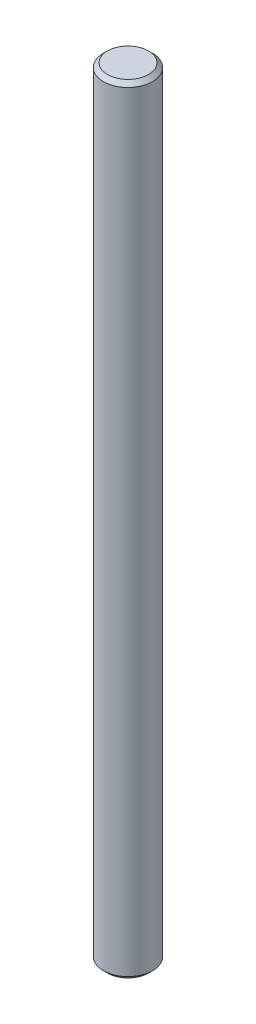
ISO-10303-21;
HEADER;
FILE_DESCRIPTION(('STEP AP214'),'2;1');
FILE_NAME('part.step','',(''),(''),'','','');
FILE_SCHEMA(('AUTOMOTIVE_DESIGN { 1 0 10303 214 1 1 1 1 }'));
ENDSEC;
DATA;
#1=APPLICATION_CONTEXT('core data for automotive mechanical design processes');
#2=APPLICATION_PROTOCOL_DEFINITION('international standard','automotive_design',2000,#1);
#3=PRODUCT_CONTEXT('',#1,'mechanical');
#4=PRODUCT('Part','Part','',(#3));
#5=PRODUCT_RELATED_PRODUCT_CATEGORY('part','',(#4));
#6=PRODUCT_DEFINITION_FORMATION('','',#4);
#7=PRODUCT_DEFINITION_CONTEXT('part definition',#1,'design');
#8=PRODUCT_DEFINITION('design','',#6,#7);
#9=PRODUCT_DEFINITION_SHAPE('','',#8);
#10=(LENGTH_UNIT() NAMED_UNIT(*) SI_UNIT(.MILLI.,.METRE.));
#11=(NAMED_UNIT(*) PLANE_ANGLE_UNIT() SI_UNIT($,.RADIAN.));
#12=(NAMED_UNIT(*) SI_UNIT($,.STERADIAN.) SOLID_ANGLE_UNIT());
#13=UNCERTAINTY_MEASURE_WITH_UNIT(LENGTH_MEASURE(1.E-05),#10,'distance_accuracy_value','');
#14=(GEOMETRIC_REPRESENTATION_CONTEXT(3) GLOBAL_UNCERTAINTY_ASSIGNED_CONTEXT((#13)) GLOBAL_UNIT_ASSIGNED_CONTEXT((#10,
#11,#12)) REPRESENTATION_CONTEXT('',''));
#15=CARTESIAN_POINT('',(0.,0.,0.));
#16=DIRECTION('',(0.,0.,1.));
#17=DIRECTION('',(1.,0.,0.));
#18=AXIS2_PLACEMENT_3D('',#15,#16,#17);
#19=CARTESIAN_POINT('',(0.,95.,0.));
#20=DIRECTION('',(0.,-1.,0.));
#21=DIRECTION('',(0.,0.,-1.));
#22=AXIS2_PLACEMENT_3D('',#19,#20,#21);
#23=CYLINDRICAL_SURFACE('',#22,3.);
#24=CARTESIAN_POINT('',(0.,0.499999999999987,0.));
#25=DIRECTION('',(0.,1.,0.));
#26=DIRECTION('',(0.,0.,1.));
#27=AXIS2_PLACEMENT_3D('',#24,#25,#26);
#28=CIRCLE('',#27,3.);
#29=CARTESIAN_POINT('',(0.,0.499999999999987,3.));
#30=VERTEX_POINT('',#29);
#31=EDGE_CURVE('E55',#30,#30,#28,.T.);
#32=ORIENTED_EDGE('',*,*,#31,.T.);
#33=EDGE_LOOP('',(#32));
#34=FACE_BOUND('',#33,.T.);
#35=CARTESIAN_POINT('',(0.,94.5,0.));
#36=DIRECTION('',(0.,1.,0.));
#37=DIRECTION('',(0.,0.,1.));
#38=AXIS2_PLACEMENT_3D('',#35,#36,#37);
#39=CIRCLE('',#38,3.);
#40=CARTESIAN_POINT('',(0.,94.5,3.));
#41=VERTEX_POINT('',#40);
#42=EDGE_CURVE('E60',#41,#41,#39,.F.);
#43=ORIENTED_EDGE('',*,*,#42,.T.);
#44=EDGE_LOOP('',(#43));
#45=FACE_BOUND('',#44,.T.);
#46=ADVANCED_FACE('F41',(#34,#45),#23,.T.);
#47=CARTESIAN_POINT('',(0.,95.,0.));
#48=DIRECTION('',(0.,1.,0.));
#49=DIRECTION('',(0.,0.,1.));
#50=AXIS2_PLACEMENT_3D('',#47,#48,#49);
#51=PLANE('',#50);
#52=CARTESIAN_POINT('',(0.,95.,0.));
#53=DIRECTION('',(0.,1.,0.));
#54=DIRECTION('',(0.,0.,1.));
#55=AXIS2_PLACEMENT_3D('',#52,#53,#54);
#56=CIRCLE('',#55,2.5);
#57=CARTESIAN_POINT('',(0.,95.,2.5));
#58=VERTEX_POINT('',#57);
#59=EDGE_CURVE('E10',#58,#58,#56,.T.);
#60=ORIENTED_EDGE('',*,*,#59,.T.);
#61=EDGE_LOOP('',(#60));
#62=FACE_BOUND('',#61,.T.);
#63=ADVANCED_FACE('F77',(#62),#51,.T.);
#64=CARTESIAN_POINT('',(0.,0.,0.));
#65=DIRECTION('',(0.,1.,0.));
#66=DIRECTION('',(0.,0.,1.));
#67=AXIS2_PLACEMENT_3D('',#64,#65,#66);
#68=PLANE('',#67);
#69=CARTESIAN_POINT('',(0.,0.,0.));
#70=DIRECTION('',(0.,1.,0.));
#71=DIRECTION('',(0.,0.,1.));
#72=AXIS2_PLACEMENT_3D('',#69,#70,#71);
#73=CIRCLE('',#72,2.5);
#74=CARTESIAN_POINT('',(0.,0.,2.5));
#75=VERTEX_POINT('',#74);
#76=EDGE_CURVE('E50',#75,#75,#73,.F.);
#77=ORIENTED_EDGE('',*,*,#76,.T.);
#78=EDGE_LOOP('',(#77));
#79=FACE_BOUND('',#78,.T.);
#80=ADVANCED_FACE('F74',(#79),#68,.F.);
#81=CARTESIAN_POINT('',(0.,0.499999999999987,0.));
#82=DIRECTION('',(0.,1.,0.));
#83=DIRECTION('',(0.,0.,1.));
#84=AXIS2_PLACEMENT_3D('',#81,#82,#83);
#85=CONICAL_SURFACE('',#84,3.,0.78539816339746);
#86=ORIENTED_EDGE('',*,*,#76,.F.);
#87=EDGE_LOOP('',(#86));
#88=FACE_BOUND('',#87,.T.);
#89=ORIENTED_EDGE('',*,*,#31,.F.);
#90=EDGE_LOOP('',(#89));
#91=FACE_BOUND('',#90,.T.);
#92=ADVANCED_FACE('F70',(#88,#91),#85,.T.);
#93=CARTESIAN_POINT('',(0.,95.,0.));
#94=DIRECTION('',(0.,-1.,0.));
#95=DIRECTION('',(0.,0.,-1.));
#96=AXIS2_PLACEMENT_3D('',#93,#94,#95);
#97=CONICAL_SURFACE('',#96,2.5,0.785398163397446);
#98=ORIENTED_EDGE('',*,*,#42,.F.);
#99=EDGE_LOOP('',(#98));
#100=FACE_BOUND('',#99,.T.);
#101=ORIENTED_EDGE('',*,*,#59,.F.);
#102=EDGE_LOOP('',(#101));
#103=FACE_BOUND('',#102,.T.);
#104=ADVANCED_FACE('F44',(#100,#103),#97,.T.);
#105=CLOSED_SHELL('',(#46,#63,#80,#92,#104));
#106=MANIFOLD_SOLID_BREP('B2',#105);
#107=ADVANCED_BREP_SHAPE_REPRESENTATION('',(#18,#106),#14);
#108=SHAPE_DEFINITION_REPRESENTATION(#9,#107);
ENDSEC;
END-ISO-10303-21;
